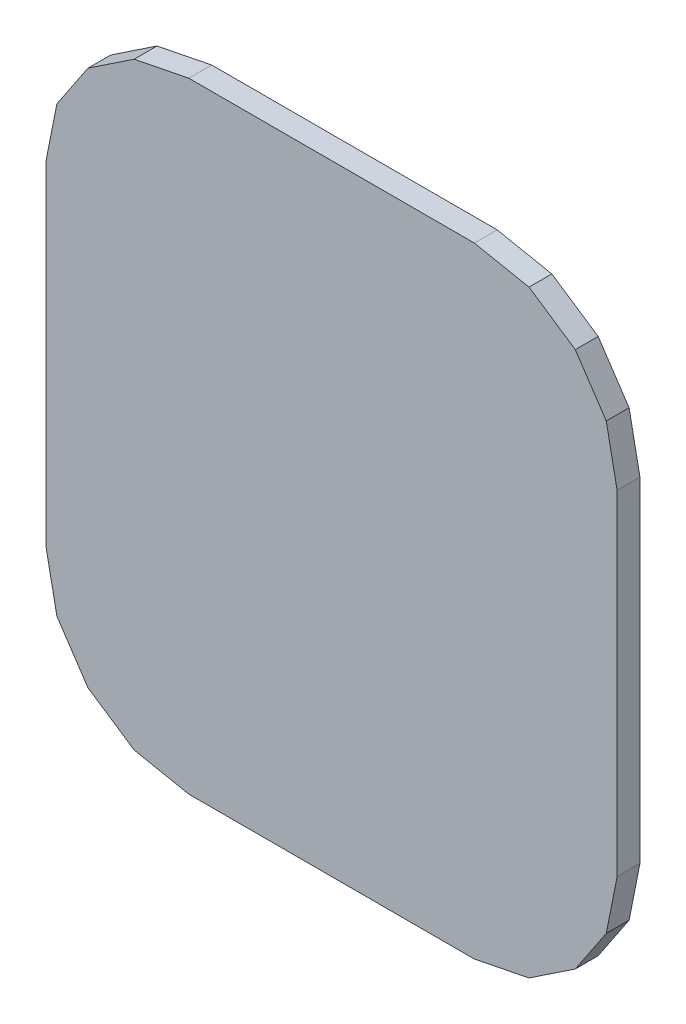
ISO-10303-21;
HEADER;
FILE_DESCRIPTION(('STEP AP214'),'2;1');
FILE_NAME('part.step','',(''),(''),'','','');
FILE_SCHEMA(('AUTOMOTIVE_DESIGN { 1 0 10303 214 1 1 1 1 }'));
ENDSEC;
DATA;
#1=APPLICATION_CONTEXT('core data for automotive mechanical design processes');
#2=APPLICATION_PROTOCOL_DEFINITION('international standard','automotive_design',2000,#1);
#3=PRODUCT_CONTEXT('',#1,'mechanical');
#4=PRODUCT('Part','Part','',(#3));
#5=PRODUCT_RELATED_PRODUCT_CATEGORY('part','',(#4));
#6=PRODUCT_DEFINITION_FORMATION('','',#4);
#7=PRODUCT_DEFINITION_CONTEXT('part definition',#1,'design');
#8=PRODUCT_DEFINITION('design','',#6,#7);
#9=PRODUCT_DEFINITION_SHAPE('','',#8);
#10=(LENGTH_UNIT() NAMED_UNIT(*) SI_UNIT(.MILLI.,.METRE.));
#11=(NAMED_UNIT(*) PLANE_ANGLE_UNIT() SI_UNIT($,.RADIAN.));
#12=(NAMED_UNIT(*) SI_UNIT($,.STERADIAN.) SOLID_ANGLE_UNIT());
#13=UNCERTAINTY_MEASURE_WITH_UNIT(LENGTH_MEASURE(1.E-05),#10,'distance_accuracy_value','');
#14=(GEOMETRIC_REPRESENTATION_CONTEXT(3) GLOBAL_UNCERTAINTY_ASSIGNED_CONTEXT((#13)) GLOBAL_UNIT_ASSIGNED_CONTEXT((#10,
#11,#12)) REPRESENTATION_CONTEXT('',''));
#15=CARTESIAN_POINT('',(0.,0.,0.));
#16=DIRECTION('',(0.,0.,1.));
#17=DIRECTION('',(1.,0.,0.));
#18=AXIS2_PLACEMENT_3D('',#15,#16,#17);
#19=CARTESIAN_POINT('',(148.134004,-58.195,1.635));
#20=DIRECTION('',(0.,0.,-1.));
#21=DIRECTION('',(0.,-1.,0.));
#22=AXIS2_PLACEMENT_3D('',#19,#20,#21);
#23=PLANE('',#22);
#24=DIRECTION('',(0.980786069727538,-0.195086353772908,0.));
#25=VECTOR('',#24,1.);
#26=CARTESIAN_POINT('',(148.352754,-57.72,1.635));
#27=LINE('',#26,#25);
#28=CARTESIAN_POINT('',(148.352754,-57.72,1.635));
#29=VERTEX_POINT('',#28);
#30=CARTESIAN_POINT('',(148.436466,-57.736651,1.635));
#31=VERTEX_POINT('',#30);
#32=EDGE_CURVE('E26',#29,#31,#27,.T.);
#33=ORIENTED_EDGE('',*,*,#32,.F.);
#34=DIRECTION('',(1.,0.,0.));
#35=VECTOR('',#34,1.);
#36=CARTESIAN_POINT('',(147.915254,-57.72,1.635));
#37=LINE('',#36,#35);
#38=CARTESIAN_POINT('',(147.915254,-57.72,1.635));
#39=VERTEX_POINT('',#38);
#40=EDGE_CURVE('E394',#39,#29,#37,.T.);
#41=ORIENTED_EDGE('',*,*,#40,.F.);
#42=DIRECTION('',(0.980786069727538,0.195086353772908,0.));
#43=VECTOR('',#42,1.);
#44=CARTESIAN_POINT('',(147.831542,-57.736651,1.635));
#45=LINE('',#44,#43);
#46=CARTESIAN_POINT('',(147.831542,-57.736651,1.635));
#47=VERTEX_POINT('',#46);
#48=EDGE_CURVE('E305',#47,#39,#45,.T.);
#49=ORIENTED_EDGE('',*,*,#48,.F.);
#50=DIRECTION('',(0.831471244473829,0.555567790294886,0.));
#51=VECTOR('',#50,1.);
#52=CARTESIAN_POINT('',(147.760574,-57.78407,1.635));
#53=LINE('',#52,#51);
#54=CARTESIAN_POINT('',(147.760574,-57.78407,1.635));
#55=VERTEX_POINT('',#54);
#56=EDGE_CURVE('E420',#55,#47,#53,.T.);
#57=ORIENTED_EDGE('',*,*,#56,.F.);
#58=DIRECTION('',(0.555567790294886,0.831471244473829,0.));
#59=VECTOR('',#58,1.);
#60=CARTESIAN_POINT('',(147.713155,-57.855038,1.635));
#61=LINE('',#60,#59);
#62=CARTESIAN_POINT('',(147.713155,-57.855038,1.635));
#63=VERTEX_POINT('',#62);
#64=EDGE_CURVE('E353',#63,#55,#61,.T.);
#65=ORIENTED_EDGE('',*,*,#64,.F.);
#66=DIRECTION('',(0.195086353772908,0.980786069727538,0.));
#67=VECTOR('',#66,1.);
#68=CARTESIAN_POINT('',(147.696504,-57.93875,1.635));
#69=LINE('',#68,#67);
#70=CARTESIAN_POINT('',(147.696504,-57.93875,1.635));
#71=VERTEX_POINT('',#70);
#72=EDGE_CURVE('E402',#71,#63,#69,.T.);
#73=ORIENTED_EDGE('',*,*,#72,.F.);
#74=DIRECTION('',(0.,1.,0.));
#75=VECTOR('',#74,1.);
#76=CARTESIAN_POINT('',(147.696504,-58.45125,1.635));
#77=LINE('',#76,#75);
#78=CARTESIAN_POINT('',(147.696504,-58.45125,1.635));
#79=VERTEX_POINT('',#78);
#80=EDGE_CURVE('E318',#79,#71,#77,.T.);
#81=ORIENTED_EDGE('',*,*,#80,.F.);
#82=DIRECTION('',(-0.195086353772908,0.980786069727538,0.));
#83=VECTOR('',#82,1.);
#84=CARTESIAN_POINT('',(147.713155,-58.534962,1.635));
#85=LINE('',#84,#83);
#86=CARTESIAN_POINT('',(147.713155,-58.534962,1.635));
#87=VERTEX_POINT('',#86);
#88=EDGE_CURVE('E247',#87,#79,#85,.T.);
#89=ORIENTED_EDGE('',*,*,#88,.F.);
#90=DIRECTION('',(-0.555567790294886,0.831471244473829,0.));
#91=VECTOR('',#90,1.);
#92=CARTESIAN_POINT('',(147.760574,-58.60593,1.635));
#93=LINE('',#92,#91);
#94=CARTESIAN_POINT('',(147.760574,-58.60593,1.635));
#95=VERTEX_POINT('',#94);
#96=EDGE_CURVE('E373',#95,#87,#93,.T.);
#97=ORIENTED_EDGE('',*,*,#96,.F.);
#98=DIRECTION('',(-0.831471244473829,0.555567790294886,0.));
#99=VECTOR('',#98,1.);
#100=CARTESIAN_POINT('',(147.831542,-58.653349,1.635));
#101=LINE('',#100,#99);
#102=CARTESIAN_POINT('',(147.831542,-58.653349,1.635));
#103=VERTEX_POINT('',#102);
#104=EDGE_CURVE('E230',#103,#95,#101,.T.);
#105=ORIENTED_EDGE('',*,*,#104,.F.);
#106=DIRECTION('',(-0.980786069727538,0.195086353772908,0.));
#107=VECTOR('',#106,1.);
#108=CARTESIAN_POINT('',(147.915254,-58.67,1.635));
#109=LINE('',#108,#107);
#110=CARTESIAN_POINT('',(147.915254,-58.67,1.635));
#111=VERTEX_POINT('',#110);
#112=EDGE_CURVE('E272',#111,#103,#109,.T.);
#113=ORIENTED_EDGE('',*,*,#112,.F.);
#114=DIRECTION('',(-1.,0.,0.));
#115=VECTOR('',#114,1.);
#116=CARTESIAN_POINT('',(148.352754,-58.67,1.635));
#117=LINE('',#116,#115);
#118=CARTESIAN_POINT('',(148.352754,-58.67,1.635));
#119=VERTEX_POINT('',#118);
#120=EDGE_CURVE('E235',#119,#111,#117,.T.);
#121=ORIENTED_EDGE('',*,*,#120,.F.);
#122=DIRECTION('',(-0.980786069727538,-0.195086353772908,0.));
#123=VECTOR('',#122,1.);
#124=CARTESIAN_POINT('',(148.436466,-58.653349,1.635));
#125=LINE('',#124,#123);
#126=CARTESIAN_POINT('',(148.436466,-58.653349,1.635));
#127=VERTEX_POINT('',#126);
#128=EDGE_CURVE('E286',#127,#119,#125,.T.);
#129=ORIENTED_EDGE('',*,*,#128,.F.);
#130=DIRECTION('',(-0.83147124447352,-0.555567790295348,0.));
#131=VECTOR('',#130,1.);
#132=CARTESIAN_POINT('',(148.507434,-58.60593,1.635));
#133=LINE('',#132,#131);
#134=CARTESIAN_POINT('',(148.507434,-58.60593,1.635));
#135=VERTEX_POINT('',#134);
#136=EDGE_CURVE('E293',#135,#127,#133,.T.);
#137=ORIENTED_EDGE('',*,*,#136,.F.);
#138=DIRECTION('',(-0.555567790296039,-0.831471244473058,0.));
#139=VECTOR('',#138,1.);
#140=CARTESIAN_POINT('',(148.554853,-58.534962,1.635));
#141=LINE('',#140,#139);
#142=CARTESIAN_POINT('',(148.554853,-58.534962,1.635));
#143=VERTEX_POINT('',#142);
#144=EDGE_CURVE('E278',#143,#135,#141,.T.);
#145=ORIENTED_EDGE('',*,*,#144,.F.);
#146=DIRECTION('',(-0.195086353772908,-0.980786069727538,0.));
#147=VECTOR('',#146,1.);
#148=CARTESIAN_POINT('',(148.571504,-58.45125,1.635));
#149=LINE('',#148,#147);
#150=CARTESIAN_POINT('',(148.571504,-58.45125,1.635));
#151=VERTEX_POINT('',#150);
#152=EDGE_CURVE('E254',#151,#143,#149,.T.);
#153=ORIENTED_EDGE('',*,*,#152,.F.);
#154=DIRECTION('',(0.,-1.,0.));
#155=VECTOR('',#154,1.);
#156=CARTESIAN_POINT('',(148.571504,-57.93875,1.635));
#157=LINE('',#156,#155);
#158=CARTESIAN_POINT('',(148.571504,-57.93875,1.635));
#159=VERTEX_POINT('',#158);
#160=EDGE_CURVE('E267',#159,#151,#157,.T.);
#161=ORIENTED_EDGE('',*,*,#160,.F.);
#162=DIRECTION('',(0.195086353772908,-0.980786069727538,0.));
#163=VECTOR('',#162,1.);
#164=CARTESIAN_POINT('',(148.554853,-57.855038,1.635));
#165=LINE('',#164,#163);
#166=CARTESIAN_POINT('',(148.554853,-57.855038,1.635));
#167=VERTEX_POINT('',#166);
#168=EDGE_CURVE('E258',#167,#159,#165,.T.);
#169=ORIENTED_EDGE('',*,*,#168,.F.);
#170=DIRECTION('',(0.555567790296039,-0.831471244473058,0.));
#171=VECTOR('',#170,1.);
#172=CARTESIAN_POINT('',(148.507434,-57.78407,1.635));
#173=LINE('',#172,#171);
#174=CARTESIAN_POINT('',(148.507434,-57.78407,1.635));
#175=VERTEX_POINT('',#174);
#176=EDGE_CURVE('E213',#175,#167,#173,.T.);
#177=ORIENTED_EDGE('',*,*,#176,.F.);
#178=DIRECTION('',(0.83147124447352,-0.555567790295348,0.));
#179=VECTOR('',#178,1.);
#180=CARTESIAN_POINT('',(148.436466,-57.736651,1.635));
#181=LINE('',#180,#179);
#182=EDGE_CURVE('E217',#31,#175,#181,.T.);
#183=ORIENTED_EDGE('',*,*,#182,.F.);
#184=EDGE_LOOP('',(#33,#41,#49,#57,#65,#73,#81,#89,#97,#105,#113,#121,#129,#137,#145,#153,#161,
#169,#177,#183));
#185=FACE_BOUND('',#184,.T.);
#186=ADVANCED_FACE('F17',(#185),#23,.F.);
#187=CARTESIAN_POINT('',(148.134004,-58.195,1.6));
#188=DIRECTION('',(0.,0.,-1.));
#189=DIRECTION('',(0.,-1.,0.));
#190=AXIS2_PLACEMENT_3D('',#187,#188,#189);
#191=PLANE('',#190);
#192=DIRECTION('',(0.83147124447352,-0.555567790295348,0.));
#193=VECTOR('',#192,1.);
#194=CARTESIAN_POINT('',(148.436466,-57.736651,1.6));
#195=LINE('',#194,#193);
#196=CARTESIAN_POINT('',(148.436466,-57.736651,1.6));
#197=VERTEX_POINT('',#196);
#198=CARTESIAN_POINT('',(148.507434,-57.78407,1.6));
#199=VERTEX_POINT('',#198);
#200=EDGE_CURVE('E201',#197,#199,#195,.T.);
#201=ORIENTED_EDGE('',*,*,#200,.T.);
#202=DIRECTION('',(0.555567790296039,-0.831471244473058,0.));
#203=VECTOR('',#202,1.);
#204=CARTESIAN_POINT('',(148.507434,-57.78407,1.6));
#205=LINE('',#204,#203);
#206=CARTESIAN_POINT('',(148.554853,-57.855038,1.6));
#207=VERTEX_POINT('',#206);
#208=EDGE_CURVE('E255',#199,#207,#205,.T.);
#209=ORIENTED_EDGE('',*,*,#208,.T.);
#210=DIRECTION('',(0.195086353772908,-0.980786069727538,0.));
#211=VECTOR('',#210,1.);
#212=CARTESIAN_POINT('',(148.554853,-57.855038,1.6));
#213=LINE('',#212,#211);
#214=CARTESIAN_POINT('',(148.571504,-57.93875,1.6));
#215=VERTEX_POINT('',#214);
#216=EDGE_CURVE('E263',#207,#215,#213,.T.);
#217=ORIENTED_EDGE('',*,*,#216,.T.);
#218=DIRECTION('',(0.,-1.,0.));
#219=VECTOR('',#218,1.);
#220=CARTESIAN_POINT('',(148.571504,-57.93875,1.6));
#221=LINE('',#220,#219);
#222=CARTESIAN_POINT('',(148.571504,-58.45125,1.6));
#223=VERTEX_POINT('',#222);
#224=EDGE_CURVE('E311',#215,#223,#221,.T.);
#225=ORIENTED_EDGE('',*,*,#224,.T.);
#226=DIRECTION('',(-0.195086353772908,-0.980786069727538,0.));
#227=VECTOR('',#226,1.);
#228=CARTESIAN_POINT('',(148.571504,-58.45125,1.6));
#229=LINE('',#228,#227);
#230=CARTESIAN_POINT('',(148.554853,-58.534962,1.6));
#231=VERTEX_POINT('',#230);
#232=EDGE_CURVE('E253',#223,#231,#229,.T.);
#233=ORIENTED_EDGE('',*,*,#232,.T.);
#234=DIRECTION('',(-0.555567790296039,-0.831471244473058,0.));
#235=VECTOR('',#234,1.);
#236=CARTESIAN_POINT('',(148.554853,-58.534962,1.6));
#237=LINE('',#236,#235);
#238=CARTESIAN_POINT('',(148.507434,-58.60593,1.6));
#239=VERTEX_POINT('',#238);
#240=EDGE_CURVE('E277',#231,#239,#237,.T.);
#241=ORIENTED_EDGE('',*,*,#240,.T.);
#242=DIRECTION('',(-0.83147124447352,-0.555567790295348,0.));
#243=VECTOR('',#242,1.);
#244=CARTESIAN_POINT('',(148.507434,-58.60593,1.6));
#245=LINE('',#244,#243);
#246=CARTESIAN_POINT('',(148.436466,-58.653349,1.6));
#247=VERTEX_POINT('',#246);
#248=EDGE_CURVE('E336',#239,#247,#245,.T.);
#249=ORIENTED_EDGE('',*,*,#248,.T.);
#250=DIRECTION('',(-0.980786069727538,-0.195086353772908,0.));
#251=VECTOR('',#250,1.);
#252=CARTESIAN_POINT('',(148.436466,-58.653349,1.6));
#253=LINE('',#252,#251);
#254=CARTESIAN_POINT('',(148.352754,-58.67,1.6));
#255=VERTEX_POINT('',#254);
#256=EDGE_CURVE('E239',#247,#255,#253,.T.);
#257=ORIENTED_EDGE('',*,*,#256,.T.);
#258=DIRECTION('',(-1.,0.,0.));
#259=VECTOR('',#258,1.);
#260=CARTESIAN_POINT('',(148.352754,-58.67,1.6));
#261=LINE('',#260,#259);
#262=CARTESIAN_POINT('',(147.915254,-58.67,1.6));
#263=VERTEX_POINT('',#262);
#264=EDGE_CURVE('E340',#255,#263,#261,.T.);
#265=ORIENTED_EDGE('',*,*,#264,.T.);
#266=DIRECTION('',(-0.980786069727538,0.195086353772908,0.));
#267=VECTOR('',#266,1.);
#268=CARTESIAN_POINT('',(147.915254,-58.67,1.6));
#269=LINE('',#268,#267);
#270=CARTESIAN_POINT('',(147.831542,-58.653349,1.6));
#271=VERTEX_POINT('',#270);
#272=EDGE_CURVE('E227',#263,#271,#269,.T.);
#273=ORIENTED_EDGE('',*,*,#272,.T.);
#274=DIRECTION('',(-0.831471244473829,0.555567790294886,0.));
#275=VECTOR('',#274,1.);
#276=CARTESIAN_POINT('',(147.831542,-58.653349,1.6));
#277=LINE('',#276,#275);
#278=CARTESIAN_POINT('',(147.760574,-58.60593,1.6));
#279=VERTEX_POINT('',#278);
#280=EDGE_CURVE('E369',#271,#279,#277,.T.);
#281=ORIENTED_EDGE('',*,*,#280,.T.);
#282=DIRECTION('',(-0.555567790294886,0.831471244473829,0.));
#283=VECTOR('',#282,1.);
#284=CARTESIAN_POINT('',(147.760574,-58.60593,1.6));
#285=LINE('',#284,#283);
#286=CARTESIAN_POINT('',(147.713155,-58.534962,1.6));
#287=VERTEX_POINT('',#286);
#288=EDGE_CURVE('E243',#279,#287,#285,.T.);
#289=ORIENTED_EDGE('',*,*,#288,.T.);
#290=DIRECTION('',(-0.195086353772908,0.980786069727538,0.));
#291=VECTOR('',#290,1.);
#292=CARTESIAN_POINT('',(147.713155,-58.534962,1.6));
#293=LINE('',#292,#291);
#294=CARTESIAN_POINT('',(147.696504,-58.45125,1.6));
#295=VERTEX_POINT('',#294);
#296=EDGE_CURVE('E323',#287,#295,#293,.T.);
#297=ORIENTED_EDGE('',*,*,#296,.T.);
#298=DIRECTION('',(0.,1.,0.));
#299=VECTOR('',#298,1.);
#300=CARTESIAN_POINT('',(147.696504,-58.45125,1.6));
#301=LINE('',#300,#299);
#302=CARTESIAN_POINT('',(147.696504,-57.93875,1.6));
#303=VERTEX_POINT('',#302);
#304=EDGE_CURVE('E393',#295,#303,#301,.T.);
#305=ORIENTED_EDGE('',*,*,#304,.T.);
#306=DIRECTION('',(0.195086353772908,0.980786069727538,0.));
#307=VECTOR('',#306,1.);
#308=CARTESIAN_POINT('',(147.696504,-57.93875,1.6));
#309=LINE('',#308,#307);
#310=CARTESIAN_POINT('',(147.713155,-57.855038,1.6));
#311=VERTEX_POINT('',#310);
#312=EDGE_CURVE('E358',#303,#311,#309,.T.);
#313=ORIENTED_EDGE('',*,*,#312,.T.);
#314=DIRECTION('',(0.555567790294886,0.831471244473829,0.));
#315=VECTOR('',#314,1.);
#316=CARTESIAN_POINT('',(147.713155,-57.855038,1.6));
#317=LINE('',#316,#315);
#318=CARTESIAN_POINT('',(147.760574,-57.78407,1.6));
#319=VERTEX_POINT('',#318);
#320=EDGE_CURVE('E416',#311,#319,#317,.T.);
#321=ORIENTED_EDGE('',*,*,#320,.T.);
#322=DIRECTION('',(0.831471244473829,0.555567790294886,0.));
#323=VECTOR('',#322,1.);
#324=CARTESIAN_POINT('',(147.760574,-57.78407,1.6));
#325=LINE('',#324,#323);
#326=CARTESIAN_POINT('',(147.831542,-57.736651,1.6));
#327=VERTEX_POINT('',#326);
#328=EDGE_CURVE('E301',#319,#327,#325,.T.);
#329=ORIENTED_EDGE('',*,*,#328,.T.);
#330=DIRECTION('',(0.980786069727538,0.195086353772908,0.));
#331=VECTOR('',#330,1.);
#332=CARTESIAN_POINT('',(147.831542,-57.736651,1.6));
#333=LINE('',#332,#331);
#334=CARTESIAN_POINT('',(147.915254,-57.72,1.6));
#335=VERTEX_POINT('',#334);
#336=EDGE_CURVE('E398',#327,#335,#333,.T.);
#337=ORIENTED_EDGE('',*,*,#336,.T.);
#338=DIRECTION('',(1.,0.,0.));
#339=VECTOR('',#338,1.);
#340=CARTESIAN_POINT('',(147.915254,-57.72,1.6));
#341=LINE('',#340,#339);
#342=CARTESIAN_POINT('',(148.352754,-57.72,1.6));
#343=VERTEX_POINT('',#342);
#344=EDGE_CURVE('E20',#335,#343,#341,.T.);
#345=ORIENTED_EDGE('',*,*,#344,.T.);
#346=DIRECTION('',(0.980786069727538,-0.195086353772908,0.));
#347=VECTOR('',#346,1.);
#348=CARTESIAN_POINT('',(148.352754,-57.72,1.6));
#349=LINE('',#348,#347);
#350=EDGE_CURVE('E11',#343,#197,#349,.T.);
#351=ORIENTED_EDGE('',*,*,#350,.T.);
#352=EDGE_LOOP('',(#201,#209,#217,#225,#233,#241,#249,#257,#265,#273,#281,#289,#297,#305,#313,
#321,#329,#337,#345,#351));
#353=FACE_BOUND('',#352,.T.);
#354=ADVANCED_FACE('F199',(#353),#191,.T.);
#355=CARTESIAN_POINT('',(148.352754,-57.72,1.6));
#356=DIRECTION('',(0.195086353772908,0.980786069727538,0.));
#357=DIRECTION('',(0.,0.,-1.));
#358=AXIS2_PLACEMENT_3D('',#355,#356,#357);
#359=PLANE('',#358);
#360=DIRECTION('',(0.,0.,1.));
#361=VECTOR('',#360,1.);
#362=CARTESIAN_POINT('',(148.352754,-57.72,1.6));
#363=LINE('',#362,#361);
#364=EDGE_CURVE('E226',#343,#29,#363,.T.);
#365=ORIENTED_EDGE('',*,*,#364,.T.);
#366=ORIENTED_EDGE('',*,*,#32,.T.);
#367=DIRECTION('',(0.,0.,1.));
#368=VECTOR('',#367,1.);
#369=CARTESIAN_POINT('',(148.436466,-57.736651,1.6));
#370=LINE('',#369,#368);
#371=EDGE_CURVE('E209',#197,#31,#370,.T.);
#372=ORIENTED_EDGE('',*,*,#371,.F.);
#373=ORIENTED_EDGE('',*,*,#350,.F.);
#374=EDGE_LOOP('',(#365,#366,#372,#373));
#375=FACE_BOUND('',#374,.T.);
#376=ADVANCED_FACE('F215',(#375),#359,.T.);
#377=CARTESIAN_POINT('',(147.915254,-57.72,1.6));
#378=DIRECTION('',(0.,1.,0.));
#379=DIRECTION('',(1.,0.,0.));
#380=AXIS2_PLACEMENT_3D('',#377,#378,#379);
#381=PLANE('',#380);
#382=DIRECTION('',(0.,0.,1.));
#383=VECTOR('',#382,1.);
#384=CARTESIAN_POINT('',(147.915254,-57.72,1.6));
#385=LINE('',#384,#383);
#386=EDGE_CURVE('E430',#335,#39,#385,.T.);
#387=ORIENTED_EDGE('',*,*,#386,.T.);
#388=ORIENTED_EDGE('',*,*,#40,.T.);
#389=ORIENTED_EDGE('',*,*,#364,.F.);
#390=ORIENTED_EDGE('',*,*,#344,.F.);
#391=EDGE_LOOP('',(#387,#388,#389,#390));
#392=FACE_BOUND('',#391,.T.);
#393=ADVANCED_FACE('F441',(#392),#381,.T.);
#394=CARTESIAN_POINT('',(147.831542,-57.736651,1.6));
#395=DIRECTION('',(-0.195086353772908,0.980786069727538,0.));
#396=DIRECTION('',(0.,0.,1.));
#397=AXIS2_PLACEMENT_3D('',#394,#395,#396);
#398=PLANE('',#397);
#399=DIRECTION('',(0.,0.,1.));
#400=VECTOR('',#399,1.);
#401=CARTESIAN_POINT('',(147.831542,-57.736651,1.6));
#402=LINE('',#401,#400);
#403=EDGE_CURVE('E306',#327,#47,#402,.T.);
#404=ORIENTED_EDGE('',*,*,#403,.T.);
#405=ORIENTED_EDGE('',*,*,#48,.T.);
#406=ORIENTED_EDGE('',*,*,#386,.F.);
#407=ORIENTED_EDGE('',*,*,#336,.F.);
#408=EDGE_LOOP('',(#404,#405,#406,#407));
#409=FACE_BOUND('',#408,.T.);
#410=ADVANCED_FACE('F439',(#409),#398,.T.);
#411=CARTESIAN_POINT('',(147.760574,-57.78407,1.6));
#412=DIRECTION('',(-0.555567790294886,0.831471244473829,0.));
#413=DIRECTION('',(0.,0.,1.));
#414=AXIS2_PLACEMENT_3D('',#411,#412,#413);
#415=PLANE('',#414);
#416=DIRECTION('',(0.,0.,1.));
#417=VECTOR('',#416,1.);
#418=CARTESIAN_POINT('',(147.760574,-57.78407,1.6));
#419=LINE('',#418,#417);
#420=EDGE_CURVE('E357',#319,#55,#419,.T.);
#421=ORIENTED_EDGE('',*,*,#420,.T.);
#422=ORIENTED_EDGE('',*,*,#56,.T.);
#423=ORIENTED_EDGE('',*,*,#403,.F.);
#424=ORIENTED_EDGE('',*,*,#328,.F.);
#425=EDGE_LOOP('',(#421,#422,#423,#424));
#426=FACE_BOUND('',#425,.T.);
#427=ADVANCED_FACE('F639',(#426),#415,.T.);
#428=CARTESIAN_POINT('',(147.713155,-57.855038,1.6));
#429=DIRECTION('',(-0.831471244473829,0.555567790294886,0.));
#430=DIRECTION('',(0.,0.,1.));
#431=AXIS2_PLACEMENT_3D('',#428,#429,#430);
#432=PLANE('',#431);
#433=DIRECTION('',(0.,0.,1.));
#434=VECTOR('',#433,1.);
#435=CARTESIAN_POINT('',(147.713155,-57.855038,1.6));
#436=LINE('',#435,#434);
#437=EDGE_CURVE('E406',#311,#63,#436,.T.);
#438=ORIENTED_EDGE('',*,*,#437,.T.);
#439=ORIENTED_EDGE('',*,*,#64,.T.);
#440=ORIENTED_EDGE('',*,*,#420,.F.);
#441=ORIENTED_EDGE('',*,*,#320,.F.);
#442=EDGE_LOOP('',(#438,#439,#440,#441));
#443=FACE_BOUND('',#442,.T.);
#444=ADVANCED_FACE('F601',(#443),#432,.T.);
#445=CARTESIAN_POINT('',(147.696504,-57.93875,1.6));
#446=DIRECTION('',(-0.980786069727538,0.195086353772908,0.));
#447=DIRECTION('',(0.,0.,1.));
#448=AXIS2_PLACEMENT_3D('',#445,#446,#447);
#449=PLANE('',#448);
#450=DIRECTION('',(0.,0.,1.));
#451=VECTOR('',#450,1.);
#452=CARTESIAN_POINT('',(147.696504,-57.93875,1.6));
#453=LINE('',#452,#451);
#454=EDGE_CURVE('E322',#303,#71,#453,.T.);
#455=ORIENTED_EDGE('',*,*,#454,.T.);
#456=ORIENTED_EDGE('',*,*,#72,.T.);
#457=ORIENTED_EDGE('',*,*,#437,.F.);
#458=ORIENTED_EDGE('',*,*,#312,.F.);
#459=EDGE_LOOP('',(#455,#456,#457,#458));
#460=FACE_BOUND('',#459,.T.);
#461=ADVANCED_FACE('F596',(#460),#449,.T.);
#462=CARTESIAN_POINT('',(147.696504,-58.45125,1.6));
#463=DIRECTION('',(-1.,0.,0.));
#464=DIRECTION('',(0.,0.,1.));
#465=AXIS2_PLACEMENT_3D('',#462,#463,#464);
#466=PLANE('',#465);
#467=DIRECTION('',(0.,0.,1.));
#468=VECTOR('',#467,1.);
#469=CARTESIAN_POINT('',(147.696504,-58.45125,1.6));
#470=LINE('',#469,#468);
#471=EDGE_CURVE('E383',#295,#79,#470,.T.);
#472=ORIENTED_EDGE('',*,*,#471,.T.);
#473=ORIENTED_EDGE('',*,*,#80,.T.);
#474=ORIENTED_EDGE('',*,*,#454,.F.);
#475=ORIENTED_EDGE('',*,*,#304,.F.);
#476=EDGE_LOOP('',(#472,#473,#474,#475));
#477=FACE_BOUND('',#476,.T.);
#478=ADVANCED_FACE('F557',(#477),#466,.T.);
#479=CARTESIAN_POINT('',(147.713155,-58.534962,1.6));
#480=DIRECTION('',(-0.980786069727538,-0.195086353772908,0.));
#481=DIRECTION('',(-0.195086353772908,0.980786069727538,0.));
#482=AXIS2_PLACEMENT_3D('',#479,#480,#481);
#483=PLANE('',#482);
#484=DIRECTION('',(0.,0.,1.));
#485=VECTOR('',#484,1.);
#486=CARTESIAN_POINT('',(147.713155,-58.534962,1.6));
#487=LINE('',#486,#485);
#488=EDGE_CURVE('E248',#287,#87,#487,.T.);
#489=ORIENTED_EDGE('',*,*,#488,.T.);
#490=ORIENTED_EDGE('',*,*,#88,.T.);
#491=ORIENTED_EDGE('',*,*,#471,.F.);
#492=ORIENTED_EDGE('',*,*,#296,.F.);
#493=EDGE_LOOP('',(#489,#490,#491,#492));
#494=FACE_BOUND('',#493,.T.);
#495=ADVANCED_FACE('F551',(#494),#483,.T.);
#496=CARTESIAN_POINT('',(147.760574,-58.60593,1.6));
#497=DIRECTION('',(-0.831471244473829,-0.555567790294886,0.));
#498=DIRECTION('',(-0.555567790294886,0.831471244473829,0.));
#499=AXIS2_PLACEMENT_3D('',#496,#497,#498);
#500=PLANE('',#499);
#501=DIRECTION('',(0.,0.,1.));
#502=VECTOR('',#501,1.);
#503=CARTESIAN_POINT('',(147.760574,-58.60593,1.6));
#504=LINE('',#503,#502);
#505=EDGE_CURVE('E365',#279,#95,#504,.T.);
#506=ORIENTED_EDGE('',*,*,#505,.T.);
#507=ORIENTED_EDGE('',*,*,#96,.T.);
#508=ORIENTED_EDGE('',*,*,#488,.F.);
#509=ORIENTED_EDGE('',*,*,#288,.F.);
#510=EDGE_LOOP('',(#506,#507,#508,#509));
#511=FACE_BOUND('',#510,.T.);
#512=ADVANCED_FACE('F556',(#511),#500,.T.);
#513=CARTESIAN_POINT('',(147.831542,-58.653349,1.6));
#514=DIRECTION('',(-0.555567790294886,-0.831471244473829,0.));
#515=DIRECTION('',(-0.831471244473829,0.555567790294886,0.));
#516=AXIS2_PLACEMENT_3D('',#513,#514,#515);
#517=PLANE('',#516);
#518=DIRECTION('',(0.,0.,1.));
#519=VECTOR('',#518,1.);
#520=CARTESIAN_POINT('',(147.831542,-58.653349,1.6));
#521=LINE('',#520,#519);
#522=EDGE_CURVE('E231',#271,#103,#521,.T.);
#523=ORIENTED_EDGE('',*,*,#522,.T.);
#524=ORIENTED_EDGE('',*,*,#104,.T.);
#525=ORIENTED_EDGE('',*,*,#505,.F.);
#526=ORIENTED_EDGE('',*,*,#280,.F.);
#527=EDGE_LOOP('',(#523,#524,#525,#526));
#528=FACE_BOUND('',#527,.T.);
#529=ADVANCED_FACE('F497',(#528),#517,.T.);
#530=CARTESIAN_POINT('',(147.915254,-58.67,1.6));
#531=DIRECTION('',(-0.195086353772908,-0.980786069727538,0.));
#532=DIRECTION('',(-0.980786069727538,0.195086353772908,0.));
#533=AXIS2_PLACEMENT_3D('',#530,#531,#532);
#534=PLANE('',#533);
#535=DIRECTION('',(0.,0.,1.));
#536=VECTOR('',#535,1.);
#537=CARTESIAN_POINT('',(147.915254,-58.67,1.6));
#538=LINE('',#537,#536);
#539=EDGE_CURVE('E238',#263,#111,#538,.T.);
#540=ORIENTED_EDGE('',*,*,#539,.T.);
#541=ORIENTED_EDGE('',*,*,#112,.T.);
#542=ORIENTED_EDGE('',*,*,#522,.F.);
#543=ORIENTED_EDGE('',*,*,#272,.F.);
#544=EDGE_LOOP('',(#540,#541,#542,#543));
#545=FACE_BOUND('',#544,.T.);
#546=ADVANCED_FACE('F491',(#545),#534,.T.);
#547=CARTESIAN_POINT('',(148.352754,-58.67,1.6));
#548=DIRECTION('',(0.,-1.,0.));
#549=DIRECTION('',(0.,0.,-1.));
#550=AXIS2_PLACEMENT_3D('',#547,#548,#549);
#551=PLANE('',#550);
#552=DIRECTION('',(0.,0.,1.));
#553=VECTOR('',#552,1.);
#554=CARTESIAN_POINT('',(148.352754,-58.67,1.6));
#555=LINE('',#554,#553);
#556=EDGE_CURVE('E282',#255,#119,#555,.T.);
#557=ORIENTED_EDGE('',*,*,#556,.T.);
#558=ORIENTED_EDGE('',*,*,#120,.T.);
#559=ORIENTED_EDGE('',*,*,#539,.F.);
#560=ORIENTED_EDGE('',*,*,#264,.F.);
#561=EDGE_LOOP('',(#557,#558,#559,#560));
#562=FACE_BOUND('',#561,.T.);
#563=ADVANCED_FACE('F496',(#562),#551,.T.);
#564=CARTESIAN_POINT('',(148.436466,-58.653349,1.6));
#565=DIRECTION('',(0.195086353772908,-0.980786069727538,0.));
#566=DIRECTION('',(0.,0.,-1.));
#567=AXIS2_PLACEMENT_3D('',#564,#565,#566);
#568=PLANE('',#567);
#569=DIRECTION('',(0.,0.,1.));
#570=VECTOR('',#569,1.);
#571=CARTESIAN_POINT('',(148.436466,-58.653349,1.6));
#572=LINE('',#571,#570);
#573=EDGE_CURVE('E297',#247,#127,#572,.T.);
#574=ORIENTED_EDGE('',*,*,#573,.T.);
#575=ORIENTED_EDGE('',*,*,#128,.T.);
#576=ORIENTED_EDGE('',*,*,#556,.F.);
#577=ORIENTED_EDGE('',*,*,#256,.F.);
#578=EDGE_LOOP('',(#574,#575,#576,#577));
#579=FACE_BOUND('',#578,.T.);
#580=ADVANCED_FACE('F510',(#579),#568,.T.);
#581=CARTESIAN_POINT('',(148.507434,-58.60593,1.6));
#582=DIRECTION('',(0.555567790295348,-0.83147124447352,0.));
#583=DIRECTION('',(0.,0.,-1.));
#584=AXIS2_PLACEMENT_3D('',#581,#582,#583);
#585=PLANE('',#584);
#586=DIRECTION('',(0.,0.,1.));
#587=VECTOR('',#586,1.);
#588=CARTESIAN_POINT('',(148.507434,-58.60593,1.6));
#589=LINE('',#588,#587);
#590=EDGE_CURVE('E273',#239,#135,#589,.T.);
#591=ORIENTED_EDGE('',*,*,#590,.T.);
#592=ORIENTED_EDGE('',*,*,#136,.T.);
#593=ORIENTED_EDGE('',*,*,#573,.F.);
#594=ORIENTED_EDGE('',*,*,#248,.F.);
#595=EDGE_LOOP('',(#591,#592,#593,#594));
#596=FACE_BOUND('',#595,.T.);
#597=ADVANCED_FACE('F504',(#596),#585,.T.);
#598=CARTESIAN_POINT('',(148.554853,-58.534962,1.6));
#599=DIRECTION('',(0.831471244473058,-0.555567790296039,0.));
#600=DIRECTION('',(0.,0.,-1.));
#601=AXIS2_PLACEMENT_3D('',#598,#599,#600);
#602=PLANE('',#601);
#603=DIRECTION('',(0.,0.,1.));
#604=VECTOR('',#603,1.);
#605=CARTESIAN_POINT('',(148.554853,-58.534962,1.6));
#606=LINE('',#605,#604);
#607=EDGE_CURVE('E249',#231,#143,#606,.T.);
#608=ORIENTED_EDGE('',*,*,#607,.T.);
#609=ORIENTED_EDGE('',*,*,#144,.T.);
#610=ORIENTED_EDGE('',*,*,#590,.F.);
#611=ORIENTED_EDGE('',*,*,#240,.F.);
#612=EDGE_LOOP('',(#608,#609,#610,#611));
#613=FACE_BOUND('',#612,.T.);
#614=ADVANCED_FACE('F509',(#613),#602,.T.);
#615=CARTESIAN_POINT('',(148.571504,-58.45125,1.6));
#616=DIRECTION('',(0.980786069727538,-0.195086353772908,0.));
#617=DIRECTION('',(0.,0.,-1.));
#618=AXIS2_PLACEMENT_3D('',#615,#616,#617);
#619=PLANE('',#618);
#620=DIRECTION('',(0.,0.,1.));
#621=VECTOR('',#620,1.);
#622=CARTESIAN_POINT('',(148.571504,-58.45125,1.6));
#623=LINE('',#622,#621);
#624=EDGE_CURVE('E307',#223,#151,#623,.T.);
#625=ORIENTED_EDGE('',*,*,#624,.T.);
#626=ORIENTED_EDGE('',*,*,#152,.T.);
#627=ORIENTED_EDGE('',*,*,#607,.F.);
#628=ORIENTED_EDGE('',*,*,#232,.F.);
#629=EDGE_LOOP('',(#625,#626,#627,#628));
#630=FACE_BOUND('',#629,.T.);
#631=ADVANCED_FACE('F590',(#630),#619,.T.);
#632=CARTESIAN_POINT('',(148.571504,-57.93875,1.6));
#633=DIRECTION('',(1.,0.,0.));
#634=DIRECTION('',(0.,1.,0.));
#635=AXIS2_PLACEMENT_3D('',#632,#633,#634);
#636=PLANE('',#635);
#637=DIRECTION('',(0.,0.,1.));
#638=VECTOR('',#637,1.);
#639=CARTESIAN_POINT('',(148.571504,-57.93875,1.6));
#640=LINE('',#639,#638);
#641=EDGE_CURVE('E268',#215,#159,#640,.T.);
#642=ORIENTED_EDGE('',*,*,#641,.T.);
#643=ORIENTED_EDGE('',*,*,#160,.T.);
#644=ORIENTED_EDGE('',*,*,#624,.F.);
#645=ORIENTED_EDGE('',*,*,#224,.F.);
#646=EDGE_LOOP('',(#642,#643,#644,#645));
#647=FACE_BOUND('',#646,.T.);
#648=ADVANCED_FACE('F581',(#647),#636,.T.);
#649=CARTESIAN_POINT('',(148.554853,-57.855038,1.6));
#650=DIRECTION('',(0.980786069727538,0.195086353772908,0.));
#651=DIRECTION('',(0.,0.,-1.));
#652=AXIS2_PLACEMENT_3D('',#649,#650,#651);
#653=PLANE('',#652);
#654=DIRECTION('',(0.,0.,1.));
#655=VECTOR('',#654,1.);
#656=CARTESIAN_POINT('',(148.554853,-57.855038,1.6));
#657=LINE('',#656,#655);
#658=EDGE_CURVE('E259',#207,#167,#657,.T.);
#659=ORIENTED_EDGE('',*,*,#658,.T.);
#660=ORIENTED_EDGE('',*,*,#168,.T.);
#661=ORIENTED_EDGE('',*,*,#641,.F.);
#662=ORIENTED_EDGE('',*,*,#216,.F.);
#663=EDGE_LOOP('',(#659,#660,#661,#662));
#664=FACE_BOUND('',#663,.T.);
#665=ADVANCED_FACE('F545',(#664),#653,.T.);
#666=CARTESIAN_POINT('',(148.507434,-57.78407,1.6));
#667=DIRECTION('',(0.831471244473058,0.555567790296039,0.));
#668=DIRECTION('',(0.,0.,-1.));
#669=AXIS2_PLACEMENT_3D('',#666,#667,#668);
#670=PLANE('',#669);
#671=DIRECTION('',(0.,0.,1.));
#672=VECTOR('',#671,1.);
#673=CARTESIAN_POINT('',(148.507434,-57.78407,1.6));
#674=LINE('',#673,#672);
#675=EDGE_CURVE('E211',#199,#175,#674,.T.);
#676=ORIENTED_EDGE('',*,*,#675,.T.);
#677=ORIENTED_EDGE('',*,*,#176,.T.);
#678=ORIENTED_EDGE('',*,*,#658,.F.);
#679=ORIENTED_EDGE('',*,*,#208,.F.);
#680=EDGE_LOOP('',(#676,#677,#678,#679));
#681=FACE_BOUND('',#680,.T.);
#682=ADVANCED_FACE('F521',(#681),#670,.T.);
#683=CARTESIAN_POINT('',(148.436466,-57.736651,1.6));
#684=DIRECTION('',(0.555567790295348,0.83147124447352,0.));
#685=DIRECTION('',(0.,0.,-1.));
#686=AXIS2_PLACEMENT_3D('',#683,#684,#685);
#687=PLANE('',#686);
#688=ORIENTED_EDGE('',*,*,#371,.T.);
#689=ORIENTED_EDGE('',*,*,#182,.T.);
#690=ORIENTED_EDGE('',*,*,#675,.F.);
#691=ORIENTED_EDGE('',*,*,#200,.F.);
#692=EDGE_LOOP('',(#688,#689,#690,#691));
#693=FACE_BOUND('',#692,.T.);
#694=ADVANCED_FACE('F207',(#693),#687,.T.);
#695=CLOSED_SHELL('',(#186,#354,#376,#393,#410,#427,#444,#461,#478,#495,#512,#529,#546,#563,
#580,#597,#614,#631,#648,#665,#682,#694));
#696=MANIFOLD_SOLID_BREP('B1',#695);
#697=ADVANCED_BREP_SHAPE_REPRESENTATION('',(#18,#696),#14);
#698=SHAPE_DEFINITION_REPRESENTATION(#9,#697);
ENDSEC;
END-ISO-10303-21;
